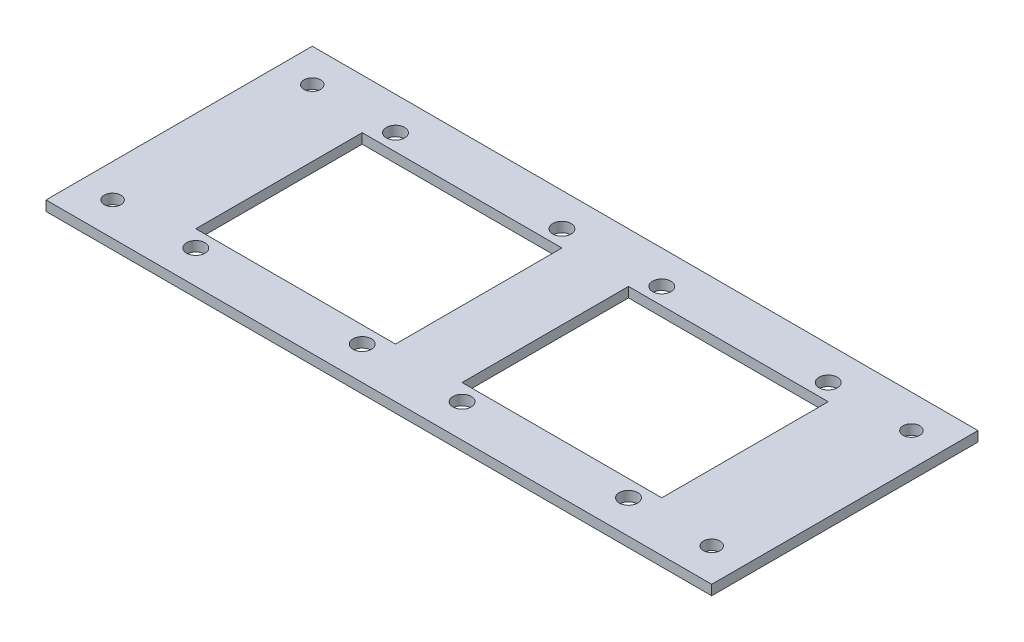
ISO-10303-21;
HEADER;
FILE_DESCRIPTION(('STEP AP214'),'2;1');
FILE_NAME('part.step','',(''),(''),'','','');
FILE_SCHEMA(('AUTOMOTIVE_DESIGN { 1 0 10303 214 1 1 1 1 }'));
ENDSEC;
DATA;
#1=APPLICATION_CONTEXT('core data for automotive mechanical design processes');
#2=APPLICATION_PROTOCOL_DEFINITION('international standard','automotive_design',2000,#1);
#3=PRODUCT_CONTEXT('',#1,'mechanical');
#4=PRODUCT('Part','Part','',(#3));
#5=PRODUCT_RELATED_PRODUCT_CATEGORY('part','',(#4));
#6=PRODUCT_DEFINITION_FORMATION('','',#4);
#7=PRODUCT_DEFINITION_CONTEXT('part definition',#1,'design');
#8=PRODUCT_DEFINITION('design','',#6,#7);
#9=PRODUCT_DEFINITION_SHAPE('','',#8);
#10=(LENGTH_UNIT() NAMED_UNIT(*) SI_UNIT(.MILLI.,.METRE.));
#11=(NAMED_UNIT(*) PLANE_ANGLE_UNIT() SI_UNIT($,.RADIAN.));
#12=(NAMED_UNIT(*) SI_UNIT($,.STERADIAN.) SOLID_ANGLE_UNIT());
#13=UNCERTAINTY_MEASURE_WITH_UNIT(LENGTH_MEASURE(1.E-05),#10,'distance_accuracy_value','');
#14=(GEOMETRIC_REPRESENTATION_CONTEXT(3) GLOBAL_UNCERTAINTY_ASSIGNED_CONTEXT((#13)) GLOBAL_UNIT_ASSIGNED_CONTEXT((#10,
#11,#12)) REPRESENTATION_CONTEXT('',''));
#15=CARTESIAN_POINT('',(0.,0.,0.));
#16=DIRECTION('',(0.,0.,1.));
#17=DIRECTION('',(1.,0.,0.));
#18=AXIS2_PLACEMENT_3D('',#15,#16,#17);
#19=CARTESIAN_POINT('',(0.,243.,7.58195858470564E-13));
#20=DIRECTION('',(0.,1.,0.));
#21=DIRECTION('',(0.,0.,1.));
#22=AXIS2_PLACEMENT_3D('',#19,#20,#21);
#23=PLANE('',#22);
#24=CARTESIAN_POINT('',(25.,243.,-20.));
#25=DIRECTION('',(0.,1.,0.));
#26=DIRECTION('',(0.,0.,1.));
#27=AXIS2_PLACEMENT_3D('',#24,#25,#26);
#28=CIRCLE('',#27,2.75);
#29=CARTESIAN_POINT('',(25.,243.,-17.25));
#30=VERTEX_POINT('',#29);
#31=EDGE_CURVE('E155',#30,#30,#28,.T.);
#32=ORIENTED_EDGE('',*,*,#31,.F.);
#33=EDGE_LOOP('',(#32));
#34=FACE_BOUND('',#33,.T.);
#35=CARTESIAN_POINT('',(75.,243.,-20.));
#36=DIRECTION('',(0.,1.,0.));
#37=DIRECTION('',(0.,0.,1.));
#38=AXIS2_PLACEMENT_3D('',#35,#36,#37);
#39=CIRCLE('',#38,2.75000000000001);
#40=CARTESIAN_POINT('',(75.,243.,-17.25));
#41=VERTEX_POINT('',#40);
#42=EDGE_CURVE('E156',#41,#41,#39,.T.);
#43=ORIENTED_EDGE('',*,*,#42,.F.);
#44=EDGE_LOOP('',(#43));
#45=FACE_BOUND('',#44,.T.);
#46=CARTESIAN_POINT('',(75.,243.,-80.));
#47=DIRECTION('',(0.,1.,0.));
#48=DIRECTION('',(0.,0.,-1.));
#49=AXIS2_PLACEMENT_3D('',#46,#47,#48);
#50=CIRCLE('',#49,2.75000000000001);
#51=CARTESIAN_POINT('',(75.,243.,-82.75));
#52=VERTEX_POINT('',#51);
#53=EDGE_CURVE('E163',#52,#52,#50,.T.);
#54=ORIENTED_EDGE('',*,*,#53,.F.);
#55=EDGE_LOOP('',(#54));
#56=FACE_BOUND('',#55,.T.);
#57=CARTESIAN_POINT('',(25.,243.,-80.));
#58=DIRECTION('',(0.,1.,0.));
#59=DIRECTION('',(0.,0.,-1.));
#60=AXIS2_PLACEMENT_3D('',#57,#58,#59);
#61=CIRCLE('',#60,2.75);
#62=CARTESIAN_POINT('',(25.,243.,-82.75));
#63=VERTEX_POINT('',#62);
#64=EDGE_CURVE('E169',#63,#63,#61,.T.);
#65=ORIENTED_EDGE('',*,*,#64,.F.);
#66=EDGE_LOOP('',(#65));
#67=FACE_BOUND('',#66,.T.);
#68=CARTESIAN_POINT('',(105.,243.,-80.));
#69=DIRECTION('',(0.,1.,0.));
#70=DIRECTION('',(0.,0.,1.));
#71=AXIS2_PLACEMENT_3D('',#68,#69,#70);
#72=CIRCLE('',#71,2.75000000000002);
#73=CARTESIAN_POINT('',(105.,243.,-77.25));
#74=VERTEX_POINT('',#73);
#75=EDGE_CURVE('E175',#74,#74,#72,.T.);
#76=ORIENTED_EDGE('',*,*,#75,.F.);
#77=EDGE_LOOP('',(#76));
#78=FACE_BOUND('',#77,.T.);
#79=CARTESIAN_POINT('',(105.,243.,-20.));
#80=DIRECTION('',(0.,1.,0.));
#81=DIRECTION('',(0.,0.,-1.));
#82=AXIS2_PLACEMENT_3D('',#79,#80,#81);
#83=CIRCLE('',#82,2.75000000000001);
#84=CARTESIAN_POINT('',(105.,243.,-22.75));
#85=VERTEX_POINT('',#84);
#86=EDGE_CURVE('E181',#85,#85,#83,.T.);
#87=ORIENTED_EDGE('',*,*,#86,.F.);
#88=EDGE_LOOP('',(#87));
#89=FACE_BOUND('',#88,.T.);
#90=CARTESIAN_POINT('',(155.,243.,-20.));
#91=DIRECTION('',(0.,1.,0.));
#92=DIRECTION('',(0.,0.,-1.));
#93=AXIS2_PLACEMENT_3D('',#90,#91,#92);
#94=CIRCLE('',#93,2.74999999999998);
#95=CARTESIAN_POINT('',(155.,243.,-22.75));
#96=VERTEX_POINT('',#95);
#97=EDGE_CURVE('E187',#96,#96,#94,.T.);
#98=ORIENTED_EDGE('',*,*,#97,.F.);
#99=EDGE_LOOP('',(#98));
#100=FACE_BOUND('',#99,.T.);
#101=CARTESIAN_POINT('',(155.,243.,-80.));
#102=DIRECTION('',(0.,1.,0.));
#103=DIRECTION('',(0.,0.,1.));
#104=AXIS2_PLACEMENT_3D('',#101,#102,#103);
#105=CIRCLE('',#104,2.74999999999998);
#106=CARTESIAN_POINT('',(155.,243.,-77.2500000000001));
#107=VERTEX_POINT('',#106);
#108=EDGE_CURVE('E193',#107,#107,#105,.T.);
#109=ORIENTED_EDGE('',*,*,#108,.F.);
#110=EDGE_LOOP('',(#109));
#111=FACE_BOUND('',#110,.T.);
#112=DIRECTION('',(0.,0.,-1.));
#113=VECTOR('',#112,1.);
#114=CARTESIAN_POINT('',(160.,243.,-25.));
#115=LINE('',#114,#113);
#116=CARTESIAN_POINT('',(160.,243.,-25.));
#117=VERTEX_POINT('',#116);
#118=CARTESIAN_POINT('',(160.,243.,-75.));
#119=VERTEX_POINT('',#118);
#120=EDGE_CURVE('E51',#117,#119,#115,.T.);
#121=ORIENTED_EDGE('',*,*,#120,.F.);
#122=DIRECTION('',(1.,0.,0.));
#123=VECTOR('',#122,1.);
#124=CARTESIAN_POINT('',(160.,243.,-25.));
#125=LINE('',#124,#123);
#126=CARTESIAN_POINT('',(100.,243.,-25.));
#127=VERTEX_POINT('',#126);
#128=EDGE_CURVE('E132',#127,#117,#125,.T.);
#129=ORIENTED_EDGE('',*,*,#128,.F.);
#130=DIRECTION('',(0.,0.,1.));
#131=VECTOR('',#130,1.);
#132=CARTESIAN_POINT('',(100.,243.,-25.));
#133=LINE('',#132,#131);
#134=CARTESIAN_POINT('',(100.,243.,-75.));
#135=VERTEX_POINT('',#134);
#136=EDGE_CURVE('E632',#135,#127,#133,.T.);
#137=ORIENTED_EDGE('',*,*,#136,.F.);
#138=DIRECTION('',(-1.,0.,0.));
#139=VECTOR('',#138,1.);
#140=CARTESIAN_POINT('',(160.,243.,-75.));
#141=LINE('',#140,#139);
#142=EDGE_CURVE('E635',#119,#135,#141,.T.);
#143=ORIENTED_EDGE('',*,*,#142,.F.);
#144=EDGE_LOOP('',(#121,#129,#137,#143));
#145=FACE_BOUND('',#144,.T.);
#146=DIRECTION('',(0.,0.,-1.));
#147=VECTOR('',#146,1.);
#148=CARTESIAN_POINT('',(80.,243.,-25.));
#149=LINE('',#148,#147);
#150=CARTESIAN_POINT('',(80.,243.,-25.));
#151=VERTEX_POINT('',#150);
#152=CARTESIAN_POINT('',(80.,243.,-75.));
#153=VERTEX_POINT('',#152);
#154=EDGE_CURVE('E59',#151,#153,#149,.T.);
#155=ORIENTED_EDGE('',*,*,#154,.F.);
#156=DIRECTION('',(1.,0.,0.));
#157=VECTOR('',#156,1.);
#158=CARTESIAN_POINT('',(20.,243.,-25.));
#159=LINE('',#158,#157);
#160=CARTESIAN_POINT('',(20.,243.,-25.));
#161=VERTEX_POINT('',#160);
#162=EDGE_CURVE('E214',#161,#151,#159,.T.);
#163=ORIENTED_EDGE('',*,*,#162,.F.);
#164=DIRECTION('',(0.,0.,1.));
#165=VECTOR('',#164,1.);
#166=CARTESIAN_POINT('',(20.,243.,-25.));
#167=LINE('',#166,#165);
#168=CARTESIAN_POINT('',(20.,243.,-75.));
#169=VERTEX_POINT('',#168);
#170=EDGE_CURVE('E211',#169,#161,#167,.T.);
#171=ORIENTED_EDGE('',*,*,#170,.F.);
#172=DIRECTION('',(-1.,0.,0.));
#173=VECTOR('',#172,1.);
#174=CARTESIAN_POINT('',(20.,243.,-75.));
#175=LINE('',#174,#173);
#176=EDGE_CURVE('E208',#153,#169,#175,.T.);
#177=ORIENTED_EDGE('',*,*,#176,.F.);
#178=EDGE_LOOP('',(#155,#163,#171,#177));
#179=FACE_BOUND('',#178,.T.);
#180=CARTESIAN_POINT('',(180.,243.,-20.));
#181=DIRECTION('',(0.,1.,0.));
#182=DIRECTION('',(0.,0.,1.));
#183=AXIS2_PLACEMENT_3D('',#180,#181,#182);
#184=CIRCLE('',#183,2.5);
#185=CARTESIAN_POINT('',(180.,243.,-17.5));
#186=VERTEX_POINT('',#185);
#187=EDGE_CURVE('E235',#186,#186,#184,.T.);
#188=ORIENTED_EDGE('',*,*,#187,.F.);
#189=EDGE_LOOP('',(#188));
#190=FACE_BOUND('',#189,.T.);
#191=CARTESIAN_POINT('',(0.,243.,-80.0000000000001));
#192=DIRECTION('',(0.,1.,0.));
#193=DIRECTION('',(0.,0.,1.));
#194=AXIS2_PLACEMENT_3D('',#191,#192,#193);
#195=CIRCLE('',#194,2.5);
#196=CARTESIAN_POINT('',(0.,243.,-77.5000000000001));
#197=VERTEX_POINT('',#196);
#198=EDGE_CURVE('E247',#197,#197,#195,.T.);
#199=ORIENTED_EDGE('',*,*,#198,.F.);
#200=EDGE_LOOP('',(#199));
#201=FACE_BOUND('',#200,.T.);
#202=DIRECTION('',(0.,0.,1.));
#203=VECTOR('',#202,1.);
#204=CARTESIAN_POINT('',(-10.,243.,-90.0000000000001));
#205=LINE('',#204,#203);
#206=CARTESIAN_POINT('',(-10.,243.,-90.0000000000001));
#207=VERTEX_POINT('',#206);
#208=CARTESIAN_POINT('',(-10.,243.,-10.0000000000001));
#209=VERTEX_POINT('',#208);
#210=EDGE_CURVE('E253',#207,#209,#205,.T.);
#211=ORIENTED_EDGE('',*,*,#210,.T.);
#212=DIRECTION('',(1.,0.,0.));
#213=VECTOR('',#212,1.);
#214=CARTESIAN_POINT('',(-10.,243.,-10.0000000000001));
#215=LINE('',#214,#213);
#216=CARTESIAN_POINT('',(190.,243.,-10.));
#217=VERTEX_POINT('',#216);
#218=EDGE_CURVE('E256',#209,#217,#215,.T.);
#219=ORIENTED_EDGE('',*,*,#218,.T.);
#220=DIRECTION('',(0.,0.,-1.));
#221=VECTOR('',#220,1.);
#222=CARTESIAN_POINT('',(190.,243.,-90.0000000000001));
#223=LINE('',#222,#221);
#224=CARTESIAN_POINT('',(190.,243.,-90.0000000000001));
#225=VERTEX_POINT('',#224);
#226=EDGE_CURVE('E259',#217,#225,#223,.T.);
#227=ORIENTED_EDGE('',*,*,#226,.T.);
#228=DIRECTION('',(-1.,0.,0.));
#229=VECTOR('',#228,1.);
#230=CARTESIAN_POINT('',(-10.,243.,-90.0000000000001));
#231=LINE('',#230,#229);
#232=EDGE_CURVE('E261',#225,#207,#231,.T.);
#233=ORIENTED_EDGE('',*,*,#232,.T.);
#234=EDGE_LOOP('',(#211,#219,#227,#233));
#235=FACE_BOUND('',#234,.T.);
#236=CARTESIAN_POINT('',(0.,243.,-20.0000000000001));
#237=DIRECTION('',(0.,1.,0.));
#238=DIRECTION('',(0.,0.,-1.));
#239=AXIS2_PLACEMENT_3D('',#236,#237,#238);
#240=CIRCLE('',#239,2.5);
#241=CARTESIAN_POINT('',(0.,243.,-22.5000000000001));
#242=VERTEX_POINT('',#241);
#243=EDGE_CURVE('E241',#242,#242,#240,.T.);
#244=ORIENTED_EDGE('',*,*,#243,.F.);
#245=EDGE_LOOP('',(#244));
#246=FACE_BOUND('',#245,.T.);
#247=CARTESIAN_POINT('',(180.,243.,-80.0000000000001));
#248=DIRECTION('',(0.,1.,0.));
#249=DIRECTION('',(0.,0.,-1.));
#250=AXIS2_PLACEMENT_3D('',#247,#248,#249);
#251=CIRCLE('',#250,2.5);
#252=CARTESIAN_POINT('',(180.,243.,-82.5000000000001));
#253=VERTEX_POINT('',#252);
#254=EDGE_CURVE('E229',#253,#253,#251,.T.);
#255=ORIENTED_EDGE('',*,*,#254,.F.);
#256=EDGE_LOOP('',(#255));
#257=FACE_BOUND('',#256,.T.);
#258=ADVANCED_FACE('F36',(#34,#45,#56,#67,#78,#89,#100,#111,#145,#179,#190,#201,#235,#246,#257),
#23,.T.);
#259=CARTESIAN_POINT('',(0.,240.,7.49400541621981E-13));
#260=DIRECTION('',(0.,1.,0.));
#261=DIRECTION('',(0.,0.,1.));
#262=AXIS2_PLACEMENT_3D('',#259,#260,#261);
#263=PLANE('',#262);
#264=CARTESIAN_POINT('',(25.,240.,-20.));
#265=DIRECTION('',(0.,1.,0.));
#266=DIRECTION('',(0.,0.,1.));
#267=AXIS2_PLACEMENT_3D('',#264,#265,#266);
#268=CIRCLE('',#267,2.75);
#269=CARTESIAN_POINT('',(25.,240.,-17.25));
#270=VERTEX_POINT('',#269);
#271=EDGE_CURVE('E152',#270,#270,#268,.F.);
#272=ORIENTED_EDGE('',*,*,#271,.F.);
#273=EDGE_LOOP('',(#272));
#274=FACE_BOUND('',#273,.T.);
#275=CARTESIAN_POINT('',(75.,240.,-20.));
#276=DIRECTION('',(0.,1.,0.));
#277=DIRECTION('',(0.,0.,1.));
#278=AXIS2_PLACEMENT_3D('',#275,#276,#277);
#279=CIRCLE('',#278,2.75000000000001);
#280=CARTESIAN_POINT('',(75.,240.,-17.25));
#281=VERTEX_POINT('',#280);
#282=EDGE_CURVE('E160',#281,#281,#279,.F.);
#283=ORIENTED_EDGE('',*,*,#282,.F.);
#284=EDGE_LOOP('',(#283));
#285=FACE_BOUND('',#284,.T.);
#286=CARTESIAN_POINT('',(75.,240.,-80.));
#287=DIRECTION('',(0.,1.,0.));
#288=DIRECTION('',(0.,0.,1.));
#289=AXIS2_PLACEMENT_3D('',#286,#287,#288);
#290=CIRCLE('',#289,2.75000000000001);
#291=CARTESIAN_POINT('',(75.,240.,-77.25));
#292=VERTEX_POINT('',#291);
#293=EDGE_CURVE('E166',#292,#292,#290,.F.);
#294=ORIENTED_EDGE('',*,*,#293,.F.);
#295=EDGE_LOOP('',(#294));
#296=FACE_BOUND('',#295,.T.);
#297=CARTESIAN_POINT('',(25.,240.,-80.));
#298=DIRECTION('',(0.,1.,0.));
#299=DIRECTION('',(0.,0.,1.));
#300=AXIS2_PLACEMENT_3D('',#297,#298,#299);
#301=CIRCLE('',#300,2.75);
#302=CARTESIAN_POINT('',(25.,240.,-77.25));
#303=VERTEX_POINT('',#302);
#304=EDGE_CURVE('E172',#303,#303,#301,.F.);
#305=ORIENTED_EDGE('',*,*,#304,.F.);
#306=EDGE_LOOP('',(#305));
#307=FACE_BOUND('',#306,.T.);
#308=CARTESIAN_POINT('',(105.,240.,-80.));
#309=DIRECTION('',(0.,1.,0.));
#310=DIRECTION('',(0.,0.,1.));
#311=AXIS2_PLACEMENT_3D('',#308,#309,#310);
#312=CIRCLE('',#311,2.75000000000002);
#313=CARTESIAN_POINT('',(105.,240.,-77.25));
#314=VERTEX_POINT('',#313);
#315=EDGE_CURVE('E178',#314,#314,#312,.F.);
#316=ORIENTED_EDGE('',*,*,#315,.F.);
#317=EDGE_LOOP('',(#316));
#318=FACE_BOUND('',#317,.T.);
#319=CARTESIAN_POINT('',(105.,240.,-20.));
#320=DIRECTION('',(0.,1.,0.));
#321=DIRECTION('',(0.,0.,1.));
#322=AXIS2_PLACEMENT_3D('',#319,#320,#321);
#323=CIRCLE('',#322,2.75000000000001);
#324=CARTESIAN_POINT('',(105.,240.,-17.25));
#325=VERTEX_POINT('',#324);
#326=EDGE_CURVE('E184',#325,#325,#323,.F.);
#327=ORIENTED_EDGE('',*,*,#326,.F.);
#328=EDGE_LOOP('',(#327));
#329=FACE_BOUND('',#328,.T.);
#330=CARTESIAN_POINT('',(155.,240.,-20.));
#331=DIRECTION('',(0.,1.,0.));
#332=DIRECTION('',(0.,0.,1.));
#333=AXIS2_PLACEMENT_3D('',#330,#331,#332);
#334=CIRCLE('',#333,2.74999999999998);
#335=CARTESIAN_POINT('',(155.,240.,-17.25));
#336=VERTEX_POINT('',#335);
#337=EDGE_CURVE('E190',#336,#336,#334,.F.);
#338=ORIENTED_EDGE('',*,*,#337,.F.);
#339=EDGE_LOOP('',(#338));
#340=FACE_BOUND('',#339,.T.);
#341=CARTESIAN_POINT('',(155.,240.,-80.));
#342=DIRECTION('',(0.,1.,0.));
#343=DIRECTION('',(0.,0.,1.));
#344=AXIS2_PLACEMENT_3D('',#341,#342,#343);
#345=CIRCLE('',#344,2.74999999999998);
#346=CARTESIAN_POINT('',(155.,240.,-77.2500000000001));
#347=VERTEX_POINT('',#346);
#348=EDGE_CURVE('E148',#347,#347,#345,.F.);
#349=ORIENTED_EDGE('',*,*,#348,.F.);
#350=EDGE_LOOP('',(#349));
#351=FACE_BOUND('',#350,.T.);
#352=DIRECTION('',(-1.,0.,0.));
#353=VECTOR('',#352,1.);
#354=CARTESIAN_POINT('',(160.,240.,-25.));
#355=LINE('',#354,#353);
#356=CARTESIAN_POINT('',(160.,240.,-25.));
#357=VERTEX_POINT('',#356);
#358=CARTESIAN_POINT('',(100.,240.,-25.));
#359=VERTEX_POINT('',#358);
#360=EDGE_CURVE('E129',#357,#359,#355,.T.);
#361=ORIENTED_EDGE('',*,*,#360,.F.);
#362=DIRECTION('',(0.,0.,1.));
#363=VECTOR('',#362,1.);
#364=CARTESIAN_POINT('',(160.,240.,-25.));
#365=LINE('',#364,#363);
#366=CARTESIAN_POINT('',(160.,240.,-75.));
#367=VERTEX_POINT('',#366);
#368=EDGE_CURVE('E137',#367,#357,#365,.T.);
#369=ORIENTED_EDGE('',*,*,#368,.F.);
#370=DIRECTION('',(1.,0.,0.));
#371=VECTOR('',#370,1.);
#372=CARTESIAN_POINT('',(160.,240.,-75.));
#373=LINE('',#372,#371);
#374=CARTESIAN_POINT('',(100.,240.,-75.));
#375=VERTEX_POINT('',#374);
#376=EDGE_CURVE('E134',#375,#367,#373,.T.);
#377=ORIENTED_EDGE('',*,*,#376,.F.);
#378=DIRECTION('',(0.,0.,-1.));
#379=VECTOR('',#378,1.);
#380=CARTESIAN_POINT('',(100.,240.,-25.));
#381=LINE('',#380,#379);
#382=EDGE_CURVE('E146',#359,#375,#381,.T.);
#383=ORIENTED_EDGE('',*,*,#382,.F.);
#384=EDGE_LOOP('',(#361,#369,#377,#383));
#385=FACE_BOUND('',#384,.T.);
#386=DIRECTION('',(-1.,0.,0.));
#387=VECTOR('',#386,1.);
#388=CARTESIAN_POINT('',(20.,240.,-25.));
#389=LINE('',#388,#387);
#390=CARTESIAN_POINT('',(80.,240.,-25.));
#391=VERTEX_POINT('',#390);
#392=CARTESIAN_POINT('',(20.,240.,-25.));
#393=VERTEX_POINT('',#392);
#394=EDGE_CURVE('E201',#391,#393,#389,.T.);
#395=ORIENTED_EDGE('',*,*,#394,.F.);
#396=DIRECTION('',(0.,0.,1.));
#397=VECTOR('',#396,1.);
#398=CARTESIAN_POINT('',(80.,240.,-25.));
#399=LINE('',#398,#397);
#400=CARTESIAN_POINT('',(80.,240.,-75.));
#401=VERTEX_POINT('',#400);
#402=EDGE_CURVE('E204',#401,#391,#399,.T.);
#403=ORIENTED_EDGE('',*,*,#402,.F.);
#404=DIRECTION('',(1.,0.,0.));
#405=VECTOR('',#404,1.);
#406=CARTESIAN_POINT('',(20.,240.,-75.));
#407=LINE('',#406,#405);
#408=CARTESIAN_POINT('',(20.,240.,-75.));
#409=VERTEX_POINT('',#408);
#410=EDGE_CURVE('E220',#409,#401,#407,.T.);
#411=ORIENTED_EDGE('',*,*,#410,.F.);
#412=DIRECTION('',(0.,0.,-1.));
#413=VECTOR('',#412,1.);
#414=CARTESIAN_POINT('',(20.,240.,-25.));
#415=LINE('',#414,#413);
#416=EDGE_CURVE('E159',#393,#409,#415,.T.);
#417=ORIENTED_EDGE('',*,*,#416,.F.);
#418=EDGE_LOOP('',(#395,#403,#411,#417));
#419=FACE_BOUND('',#418,.T.);
#420=DIRECTION('',(0.,0.,1.));
#421=VECTOR('',#420,1.);
#422=CARTESIAN_POINT('',(-10.,240.,-90.0000000000001));
#423=LINE('',#422,#421);
#424=CARTESIAN_POINT('',(-10.,240.,-90.0000000000001));
#425=VERTEX_POINT('',#424);
#426=CARTESIAN_POINT('',(-10.,240.,-10.0000000000001));
#427=VERTEX_POINT('',#426);
#428=EDGE_CURVE('E250',#425,#427,#423,.T.);
#429=ORIENTED_EDGE('',*,*,#428,.F.);
#430=DIRECTION('',(-1.,0.,0.));
#431=VECTOR('',#430,1.);
#432=CARTESIAN_POINT('',(-10.,240.,-90.0000000000001));
#433=LINE('',#432,#431);
#434=CARTESIAN_POINT('',(190.,240.,-90.0000000000001));
#435=VERTEX_POINT('',#434);
#436=EDGE_CURVE('E257',#435,#425,#433,.T.);
#437=ORIENTED_EDGE('',*,*,#436,.F.);
#438=DIRECTION('',(0.,0.,-1.));
#439=VECTOR('',#438,1.);
#440=CARTESIAN_POINT('',(190.,240.,-90.0000000000001));
#441=LINE('',#440,#439);
#442=CARTESIAN_POINT('',(190.,240.,-10.));
#443=VERTEX_POINT('',#442);
#444=EDGE_CURVE('E268',#443,#435,#441,.T.);
#445=ORIENTED_EDGE('',*,*,#444,.F.);
#446=DIRECTION('',(1.,0.,0.));
#447=VECTOR('',#446,1.);
#448=CARTESIAN_POINT('',(-10.,240.,-10.0000000000001));
#449=LINE('',#448,#447);
#450=EDGE_CURVE('E266',#427,#443,#449,.T.);
#451=ORIENTED_EDGE('',*,*,#450,.F.);
#452=EDGE_LOOP('',(#429,#437,#445,#451));
#453=FACE_BOUND('',#452,.T.);
#454=CARTESIAN_POINT('',(0.,240.,-80.0000000000001));
#455=DIRECTION('',(0.,1.,0.));
#456=DIRECTION('',(0.,0.,1.));
#457=AXIS2_PLACEMENT_3D('',#454,#455,#456);
#458=CIRCLE('',#457,2.5);
#459=CARTESIAN_POINT('',(0.,240.,-77.5000000000001));
#460=VERTEX_POINT('',#459);
#461=EDGE_CURVE('E244',#460,#460,#458,.T.);
#462=ORIENTED_EDGE('',*,*,#461,.T.);
#463=EDGE_LOOP('',(#462));
#464=FACE_BOUND('',#463,.T.);
#465=CARTESIAN_POINT('',(0.,240.,-20.0000000000001));
#466=DIRECTION('',(0.,1.,0.));
#467=DIRECTION('',(0.,0.,-1.));
#468=AXIS2_PLACEMENT_3D('',#465,#466,#467);
#469=CIRCLE('',#468,2.5);
#470=CARTESIAN_POINT('',(0.,240.,-22.5000000000001));
#471=VERTEX_POINT('',#470);
#472=EDGE_CURVE('E238',#471,#471,#469,.T.);
#473=ORIENTED_EDGE('',*,*,#472,.T.);
#474=EDGE_LOOP('',(#473));
#475=FACE_BOUND('',#474,.T.);
#476=CARTESIAN_POINT('',(180.,240.,-20.));
#477=DIRECTION('',(0.,1.,0.));
#478=DIRECTION('',(0.,0.,1.));
#479=AXIS2_PLACEMENT_3D('',#476,#477,#478);
#480=CIRCLE('',#479,2.5);
#481=CARTESIAN_POINT('',(180.,240.,-17.5000000000001));
#482=VERTEX_POINT('',#481);
#483=EDGE_CURVE('E232',#482,#482,#480,.T.);
#484=ORIENTED_EDGE('',*,*,#483,.T.);
#485=EDGE_LOOP('',(#484));
#486=FACE_BOUND('',#485,.T.);
#487=CARTESIAN_POINT('',(180.,240.,-80.0000000000001));
#488=DIRECTION('',(0.,1.,0.));
#489=DIRECTION('',(0.,0.,-1.));
#490=AXIS2_PLACEMENT_3D('',#487,#488,#489);
#491=CIRCLE('',#490,2.5);
#492=CARTESIAN_POINT('',(180.,240.,-82.5000000000001));
#493=VERTEX_POINT('',#492);
#494=EDGE_CURVE('E228',#493,#493,#491,.T.);
#495=ORIENTED_EDGE('',*,*,#494,.T.);
#496=EDGE_LOOP('',(#495));
#497=FACE_BOUND('',#496,.T.);
#498=ADVANCED_FACE('F144',(#274,#285,#296,#307,#318,#329,#340,#351,#385,#419,#453,#464,#475,
#486,#497),#263,.F.);
#499=CARTESIAN_POINT('',(-10.,243.,-90.0000000000001));
#500=DIRECTION('',(1.,0.,0.));
#501=DIRECTION('',(0.,1.,0.));
#502=AXIS2_PLACEMENT_3D('',#499,#500,#501);
#503=PLANE('',#502);
#504=ORIENTED_EDGE('',*,*,#428,.T.);
#505=DIRECTION('',(0.,-1.,0.));
#506=VECTOR('',#505,1.);
#507=CARTESIAN_POINT('',(-10.,243.,-10.0000000000001));
#508=LINE('',#507,#506);
#509=EDGE_CURVE('E11',#209,#427,#508,.T.);
#510=ORIENTED_EDGE('',*,*,#509,.F.);
#511=ORIENTED_EDGE('',*,*,#210,.F.);
#512=DIRECTION('',(0.,-1.,0.));
#513=VECTOR('',#512,1.);
#514=CARTESIAN_POINT('',(-10.,243.,-90.0000000000001));
#515=LINE('',#514,#513);
#516=EDGE_CURVE('E263',#207,#425,#515,.T.);
#517=ORIENTED_EDGE('',*,*,#516,.T.);
#518=EDGE_LOOP('',(#504,#510,#511,#517));
#519=FACE_BOUND('',#518,.T.);
#520=ADVANCED_FACE('F38',(#519),#503,.F.);
#521=CARTESIAN_POINT('',(-10.,243.,-10.0000000000001));
#522=DIRECTION('',(0.,0.,-1.));
#523=DIRECTION('',(0.,1.,0.));
#524=AXIS2_PLACEMENT_3D('',#521,#522,#523);
#525=PLANE('',#524);
#526=ORIENTED_EDGE('',*,*,#450,.T.);
#527=DIRECTION('',(0.,-1.,0.));
#528=VECTOR('',#527,1.);
#529=CARTESIAN_POINT('',(190.,243.,-10.));
#530=LINE('',#529,#528);
#531=EDGE_CURVE('E44',#217,#443,#530,.T.);
#532=ORIENTED_EDGE('',*,*,#531,.F.);
#533=ORIENTED_EDGE('',*,*,#218,.F.);
#534=ORIENTED_EDGE('',*,*,#509,.T.);
#535=EDGE_LOOP('',(#526,#532,#533,#534));
#536=FACE_BOUND('',#535,.T.);
#537=ADVANCED_FACE('F296',(#536),#525,.F.);
#538=CARTESIAN_POINT('',(190.,243.,-90.0000000000001));
#539=DIRECTION('',(-1.,0.,0.));
#540=DIRECTION('',(0.,-1.,0.));
#541=AXIS2_PLACEMENT_3D('',#538,#539,#540);
#542=PLANE('',#541);
#543=ORIENTED_EDGE('',*,*,#444,.T.);
#544=DIRECTION('',(0.,-1.,0.));
#545=VECTOR('',#544,1.);
#546=CARTESIAN_POINT('',(190.,243.,-90.0000000000001));
#547=LINE('',#546,#545);
#548=EDGE_CURVE('E273',#225,#435,#547,.T.);
#549=ORIENTED_EDGE('',*,*,#548,.F.);
#550=ORIENTED_EDGE('',*,*,#226,.F.);
#551=ORIENTED_EDGE('',*,*,#531,.T.);
#552=EDGE_LOOP('',(#543,#549,#550,#551));
#553=FACE_BOUND('',#552,.T.);
#554=ADVANCED_FACE('F280',(#553),#542,.F.);
#555=CARTESIAN_POINT('',(-10.,243.,-90.0000000000001));
#556=DIRECTION('',(0.,0.,1.));
#557=DIRECTION('',(0.,-1.,0.));
#558=AXIS2_PLACEMENT_3D('',#555,#556,#557);
#559=PLANE('',#558);
#560=ORIENTED_EDGE('',*,*,#436,.T.);
#561=ORIENTED_EDGE('',*,*,#516,.F.);
#562=ORIENTED_EDGE('',*,*,#232,.F.);
#563=ORIENTED_EDGE('',*,*,#548,.T.);
#564=EDGE_LOOP('',(#560,#561,#562,#563));
#565=FACE_BOUND('',#564,.T.);
#566=ADVANCED_FACE('F289',(#565),#559,.F.);
#567=CARTESIAN_POINT('',(0.,243.,-80.0000000000001));
#568=DIRECTION('',(0.,-1.,0.));
#569=DIRECTION('',(0.,0.,-1.));
#570=AXIS2_PLACEMENT_3D('',#567,#568,#569);
#571=CYLINDRICAL_SURFACE('',#570,2.5);
#572=ORIENTED_EDGE('',*,*,#198,.T.);
#573=EDGE_LOOP('',(#572));
#574=FACE_BOUND('',#573,.T.);
#575=ORIENTED_EDGE('',*,*,#461,.F.);
#576=EDGE_LOOP('',(#575));
#577=FACE_BOUND('',#576,.T.);
#578=ADVANCED_FACE('F314',(#574,#577),#571,.F.);
#579=CARTESIAN_POINT('',(0.,243.,-20.0000000000001));
#580=DIRECTION('',(0.,-1.,0.));
#581=DIRECTION('',(0.,0.,-1.));
#582=AXIS2_PLACEMENT_3D('',#579,#580,#581);
#583=CYLINDRICAL_SURFACE('',#582,2.5);
#584=ORIENTED_EDGE('',*,*,#243,.T.);
#585=EDGE_LOOP('',(#584));
#586=FACE_BOUND('',#585,.T.);
#587=ORIENTED_EDGE('',*,*,#472,.F.);
#588=EDGE_LOOP('',(#587));
#589=FACE_BOUND('',#588,.T.);
#590=ADVANCED_FACE('F321',(#586,#589),#583,.F.);
#591=CARTESIAN_POINT('',(180.,243.,-20.));
#592=DIRECTION('',(0.,-1.,0.));
#593=DIRECTION('',(0.,0.,-1.));
#594=AXIS2_PLACEMENT_3D('',#591,#592,#593);
#595=CYLINDRICAL_SURFACE('',#594,2.5);
#596=ORIENTED_EDGE('',*,*,#187,.T.);
#597=EDGE_LOOP('',(#596));
#598=FACE_BOUND('',#597,.T.);
#599=ORIENTED_EDGE('',*,*,#483,.F.);
#600=EDGE_LOOP('',(#599));
#601=FACE_BOUND('',#600,.T.);
#602=ADVANCED_FACE('F326',(#598,#601),#595,.F.);
#603=CARTESIAN_POINT('',(180.,243.,-80.0000000000001));
#604=DIRECTION('',(0.,-1.,0.));
#605=DIRECTION('',(0.,0.,-1.));
#606=AXIS2_PLACEMENT_3D('',#603,#604,#605);
#607=CYLINDRICAL_SURFACE('',#606,2.5);
#608=ORIENTED_EDGE('',*,*,#254,.T.);
#609=EDGE_LOOP('',(#608));
#610=FACE_BOUND('',#609,.T.);
#611=ORIENTED_EDGE('',*,*,#494,.F.);
#612=EDGE_LOOP('',(#611));
#613=FACE_BOUND('',#612,.T.);
#614=ADVANCED_FACE('F338',(#610,#613),#607,.F.);
#615=CARTESIAN_POINT('',(80.,239.999,-25.));
#616=DIRECTION('',(1.,0.,0.));
#617=DIRECTION('',(0.,0.,-1.));
#618=AXIS2_PLACEMENT_3D('',#615,#616,#617);
#619=PLANE('',#618);
#620=ORIENTED_EDGE('',*,*,#402,.T.);
#621=DIRECTION('',(0.,1.,0.));
#622=VECTOR('',#621,1.);
#623=CARTESIAN_POINT('',(80.,239.999,-25.));
#624=LINE('',#623,#622);
#625=EDGE_CURVE('E218',#391,#151,#624,.T.);
#626=ORIENTED_EDGE('',*,*,#625,.T.);
#627=ORIENTED_EDGE('',*,*,#154,.T.);
#628=DIRECTION('',(0.,1.,0.));
#629=VECTOR('',#628,1.);
#630=CARTESIAN_POINT('',(80.,239.999,-75.));
#631=LINE('',#630,#629);
#632=EDGE_CURVE('E217',#401,#153,#631,.T.);
#633=ORIENTED_EDGE('',*,*,#632,.F.);
#634=EDGE_LOOP('',(#620,#626,#627,#633));
#635=FACE_BOUND('',#634,.T.);
#636=ADVANCED_FACE('F340',(#635),#619,.F.);
#637=CARTESIAN_POINT('',(20.,239.999,-25.));
#638=DIRECTION('',(0.,0.,1.));
#639=DIRECTION('',(0.,-1.,0.));
#640=AXIS2_PLACEMENT_3D('',#637,#638,#639);
#641=PLANE('',#640);
#642=ORIENTED_EDGE('',*,*,#394,.T.);
#643=DIRECTION('',(0.,1.,0.));
#644=VECTOR('',#643,1.);
#645=CARTESIAN_POINT('',(20.,239.999,-25.));
#646=LINE('',#645,#644);
#647=EDGE_CURVE('E221',#393,#161,#646,.T.);
#648=ORIENTED_EDGE('',*,*,#647,.T.);
#649=ORIENTED_EDGE('',*,*,#162,.T.);
#650=ORIENTED_EDGE('',*,*,#625,.F.);
#651=EDGE_LOOP('',(#642,#648,#649,#650));
#652=FACE_BOUND('',#651,.T.);
#653=ADVANCED_FACE('F347',(#652),#641,.F.);
#654=CARTESIAN_POINT('',(20.,239.999,-25.));
#655=DIRECTION('',(-1.,0.,0.));
#656=DIRECTION('',(0.,0.,1.));
#657=AXIS2_PLACEMENT_3D('',#654,#655,#656);
#658=PLANE('',#657);
#659=ORIENTED_EDGE('',*,*,#416,.T.);
#660=DIRECTION('',(0.,1.,0.));
#661=VECTOR('',#660,1.);
#662=CARTESIAN_POINT('',(20.,239.999,-75.));
#663=LINE('',#662,#661);
#664=EDGE_CURVE('E223',#409,#169,#663,.T.);
#665=ORIENTED_EDGE('',*,*,#664,.T.);
#666=ORIENTED_EDGE('',*,*,#170,.T.);
#667=ORIENTED_EDGE('',*,*,#647,.F.);
#668=EDGE_LOOP('',(#659,#665,#666,#667));
#669=FACE_BOUND('',#668,.T.);
#670=ADVANCED_FACE('F355',(#669),#658,.F.);
#671=CARTESIAN_POINT('',(20.,239.999,-75.));
#672=DIRECTION('',(0.,0.,-1.));
#673=DIRECTION('',(0.,1.,0.));
#674=AXIS2_PLACEMENT_3D('',#671,#672,#673);
#675=PLANE('',#674);
#676=ORIENTED_EDGE('',*,*,#410,.T.);
#677=ORIENTED_EDGE('',*,*,#632,.T.);
#678=ORIENTED_EDGE('',*,*,#176,.T.);
#679=ORIENTED_EDGE('',*,*,#664,.F.);
#680=EDGE_LOOP('',(#676,#677,#678,#679));
#681=FACE_BOUND('',#680,.T.);
#682=ADVANCED_FACE('F352',(#681),#675,.F.);
#683=CARTESIAN_POINT('',(160.,239.999,-25.));
#684=DIRECTION('',(1.,0.,0.));
#685=DIRECTION('',(0.,0.,-1.));
#686=AXIS2_PLACEMENT_3D('',#683,#684,#685);
#687=PLANE('',#686);
#688=ORIENTED_EDGE('',*,*,#368,.T.);
#689=DIRECTION('',(0.,1.,0.));
#690=VECTOR('',#689,1.);
#691=CARTESIAN_POINT('',(160.,239.999,-25.));
#692=LINE('',#691,#690);
#693=EDGE_CURVE('E125',#357,#117,#692,.T.);
#694=ORIENTED_EDGE('',*,*,#693,.T.);
#695=ORIENTED_EDGE('',*,*,#120,.T.);
#696=DIRECTION('',(0.,1.,0.));
#697=VECTOR('',#696,1.);
#698=CARTESIAN_POINT('',(160.,239.999,-75.));
#699=LINE('',#698,#697);
#700=EDGE_CURVE('E139',#367,#119,#699,.T.);
#701=ORIENTED_EDGE('',*,*,#700,.F.);
#702=EDGE_LOOP('',(#688,#694,#695,#701));
#703=FACE_BOUND('',#702,.T.);
#704=ADVANCED_FACE('F138',(#703),#687,.F.);
#705=CARTESIAN_POINT('',(160.,239.999,-25.));
#706=DIRECTION('',(0.,0.,1.));
#707=DIRECTION('',(0.,-1.,0.));
#708=AXIS2_PLACEMENT_3D('',#705,#706,#707);
#709=PLANE('',#708);
#710=ORIENTED_EDGE('',*,*,#360,.T.);
#711=DIRECTION('',(0.,1.,0.));
#712=VECTOR('',#711,1.);
#713=CARTESIAN_POINT('',(100.,239.999,-25.));
#714=LINE('',#713,#712);
#715=EDGE_CURVE('E133',#359,#127,#714,.T.);
#716=ORIENTED_EDGE('',*,*,#715,.T.);
#717=ORIENTED_EDGE('',*,*,#128,.T.);
#718=ORIENTED_EDGE('',*,*,#693,.F.);
#719=EDGE_LOOP('',(#710,#716,#717,#718));
#720=FACE_BOUND('',#719,.T.);
#721=ADVANCED_FACE('F127',(#720),#709,.F.);
#722=CARTESIAN_POINT('',(100.,239.999,-25.));
#723=DIRECTION('',(-1.,0.,0.));
#724=DIRECTION('',(0.,0.,1.));
#725=AXIS2_PLACEMENT_3D('',#722,#723,#724);
#726=PLANE('',#725);
#727=ORIENTED_EDGE('',*,*,#382,.T.);
#728=DIRECTION('',(0.,1.,0.));
#729=VECTOR('',#728,1.);
#730=CARTESIAN_POINT('',(100.,239.999,-75.));
#731=LINE('',#730,#729);
#732=EDGE_CURVE('E625',#375,#135,#731,.T.);
#733=ORIENTED_EDGE('',*,*,#732,.T.);
#734=ORIENTED_EDGE('',*,*,#136,.T.);
#735=ORIENTED_EDGE('',*,*,#715,.F.);
#736=EDGE_LOOP('',(#727,#733,#734,#735));
#737=FACE_BOUND('',#736,.T.);
#738=ADVANCED_FACE('F398',(#737),#726,.F.);
#739=CARTESIAN_POINT('',(160.,239.999,-75.));
#740=DIRECTION('',(0.,0.,-1.));
#741=DIRECTION('',(0.,1.,0.));
#742=AXIS2_PLACEMENT_3D('',#739,#740,#741);
#743=PLANE('',#742);
#744=ORIENTED_EDGE('',*,*,#376,.T.);
#745=ORIENTED_EDGE('',*,*,#700,.T.);
#746=ORIENTED_EDGE('',*,*,#142,.T.);
#747=ORIENTED_EDGE('',*,*,#732,.F.);
#748=EDGE_LOOP('',(#744,#745,#746,#747));
#749=FACE_BOUND('',#748,.T.);
#750=ADVANCED_FACE('F367',(#749),#743,.F.);
#751=CARTESIAN_POINT('',(155.,239.999,-80.));
#752=DIRECTION('',(0.,1.,0.));
#753=DIRECTION('',(0.,0.,1.));
#754=AXIS2_PLACEMENT_3D('',#751,#752,#753);
#755=CYLINDRICAL_SURFACE('',#754,2.74999999999998);
#756=ORIENTED_EDGE('',*,*,#108,.T.);
#757=EDGE_LOOP('',(#756));
#758=FACE_BOUND('',#757,.T.);
#759=ORIENTED_EDGE('',*,*,#348,.T.);
#760=EDGE_LOOP('',(#759));
#761=FACE_BOUND('',#760,.T.);
#762=ADVANCED_FACE('F363',(#758,#761),#755,.F.);
#763=CARTESIAN_POINT('',(155.,239.999,-20.));
#764=DIRECTION('',(0.,1.,0.));
#765=DIRECTION('',(0.,0.,1.));
#766=AXIS2_PLACEMENT_3D('',#763,#764,#765);
#767=CYLINDRICAL_SURFACE('',#766,2.74999999999998);
#768=ORIENTED_EDGE('',*,*,#97,.T.);
#769=EDGE_LOOP('',(#768));
#770=FACE_BOUND('',#769,.T.);
#771=ORIENTED_EDGE('',*,*,#337,.T.);
#772=EDGE_LOOP('',(#771));
#773=FACE_BOUND('',#772,.T.);
#774=ADVANCED_FACE('F366',(#770,#773),#767,.F.);
#775=CARTESIAN_POINT('',(105.,239.999,-20.));
#776=DIRECTION('',(0.,1.,0.));
#777=DIRECTION('',(0.,0.,1.));
#778=AXIS2_PLACEMENT_3D('',#775,#776,#777);
#779=CYLINDRICAL_SURFACE('',#778,2.75000000000001);
#780=ORIENTED_EDGE('',*,*,#86,.T.);
#781=EDGE_LOOP('',(#780));
#782=FACE_BOUND('',#781,.T.);
#783=ORIENTED_EDGE('',*,*,#326,.T.);
#784=EDGE_LOOP('',(#783));
#785=FACE_BOUND('',#784,.T.);
#786=ADVANCED_FACE('F371',(#782,#785),#779,.F.);
#787=CARTESIAN_POINT('',(105.,239.999,-80.));
#788=DIRECTION('',(0.,1.,0.));
#789=DIRECTION('',(0.,0.,1.));
#790=AXIS2_PLACEMENT_3D('',#787,#788,#789);
#791=CYLINDRICAL_SURFACE('',#790,2.75000000000002);
#792=ORIENTED_EDGE('',*,*,#75,.T.);
#793=EDGE_LOOP('',(#792));
#794=FACE_BOUND('',#793,.T.);
#795=ORIENTED_EDGE('',*,*,#315,.T.);
#796=EDGE_LOOP('',(#795));
#797=FACE_BOUND('',#796,.T.);
#798=ADVANCED_FACE('F375',(#794,#797),#791,.F.);
#799=CARTESIAN_POINT('',(25.,239.999,-80.));
#800=DIRECTION('',(0.,1.,0.));
#801=DIRECTION('',(0.,0.,1.));
#802=AXIS2_PLACEMENT_3D('',#799,#800,#801);
#803=CYLINDRICAL_SURFACE('',#802,2.75);
#804=ORIENTED_EDGE('',*,*,#64,.T.);
#805=EDGE_LOOP('',(#804));
#806=FACE_BOUND('',#805,.T.);
#807=ORIENTED_EDGE('',*,*,#304,.T.);
#808=EDGE_LOOP('',(#807));
#809=FACE_BOUND('',#808,.T.);
#810=ADVANCED_FACE('F379',(#806,#809),#803,.F.);
#811=CARTESIAN_POINT('',(75.,239.999,-80.));
#812=DIRECTION('',(0.,1.,0.));
#813=DIRECTION('',(0.,0.,1.));
#814=AXIS2_PLACEMENT_3D('',#811,#812,#813);
#815=CYLINDRICAL_SURFACE('',#814,2.75000000000001);
#816=ORIENTED_EDGE('',*,*,#53,.T.);
#817=EDGE_LOOP('',(#816));
#818=FACE_BOUND('',#817,.T.);
#819=ORIENTED_EDGE('',*,*,#293,.T.);
#820=EDGE_LOOP('',(#819));
#821=FACE_BOUND('',#820,.T.);
#822=ADVANCED_FACE('F383',(#818,#821),#815,.F.);
#823=CARTESIAN_POINT('',(75.,239.999,-20.));
#824=DIRECTION('',(0.,1.,0.));
#825=DIRECTION('',(0.,0.,1.));
#826=AXIS2_PLACEMENT_3D('',#823,#824,#825);
#827=CYLINDRICAL_SURFACE('',#826,2.75000000000001);
#828=ORIENTED_EDGE('',*,*,#42,.T.);
#829=EDGE_LOOP('',(#828));
#830=FACE_BOUND('',#829,.T.);
#831=ORIENTED_EDGE('',*,*,#282,.T.);
#832=EDGE_LOOP('',(#831));
#833=FACE_BOUND('',#832,.T.);
#834=ADVANCED_FACE('F387',(#830,#833),#827,.F.);
#835=CARTESIAN_POINT('',(25.,239.999,-20.));
#836=DIRECTION('',(0.,1.,0.));
#837=DIRECTION('',(0.,0.,1.));
#838=AXIS2_PLACEMENT_3D('',#835,#836,#837);
#839=CYLINDRICAL_SURFACE('',#838,2.75);
#840=ORIENTED_EDGE('',*,*,#31,.T.);
#841=EDGE_LOOP('',(#840));
#842=FACE_BOUND('',#841,.T.);
#843=ORIENTED_EDGE('',*,*,#271,.T.);
#844=EDGE_LOOP('',(#843));
#845=FACE_BOUND('',#844,.T.);
#846=ADVANCED_FACE('F391',(#842,#845),#839,.F.);
#847=CLOSED_SHELL('',(#258,#498,#520,#537,#554,#566,#578,#590,#602,#614,#636,#653,#670,#682,
#704,#721,#738,#750,#762,#774,#786,#798,#810,#822,#834,#846));
#848=MANIFOLD_SOLID_BREP('B2',#847);
#849=ADVANCED_BREP_SHAPE_REPRESENTATION('',(#18,#848),#14);
#850=SHAPE_DEFINITION_REPRESENTATION(#9,#849);
ENDSEC;
END-ISO-10303-21;
